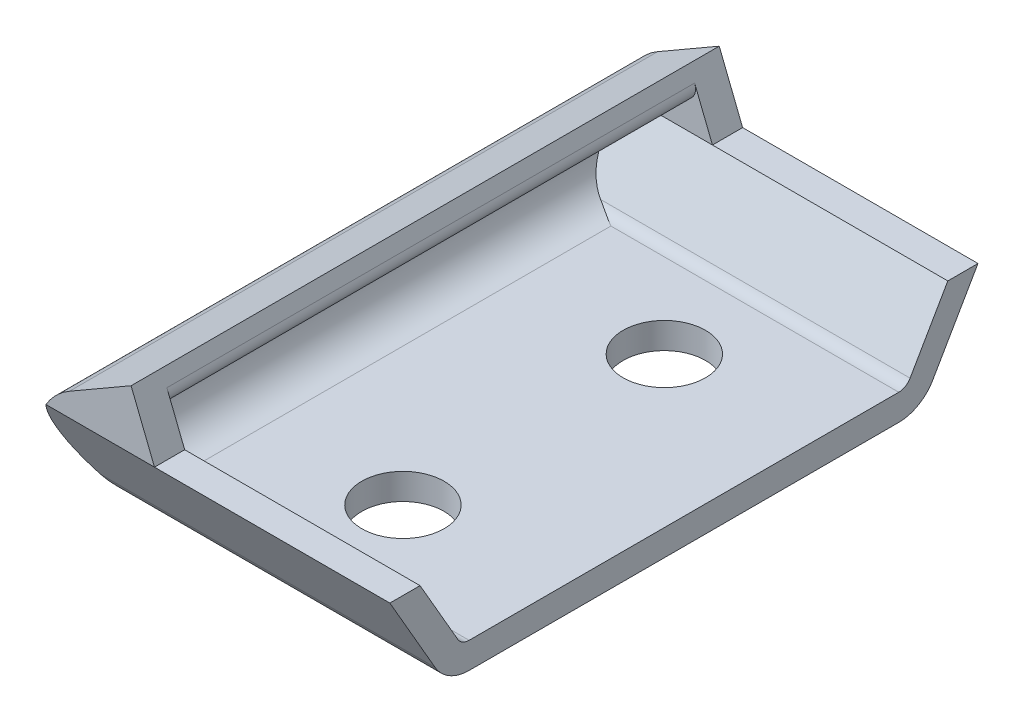
ISO-10303-21;
HEADER;
FILE_DESCRIPTION(('STEP AP214'),'2;1');
FILE_NAME('part.step','',(''),(''),'','','');
FILE_SCHEMA(('AUTOMOTIVE_DESIGN { 1 0 10303 214 1 1 1 1 }'));
ENDSEC;
DATA;
#1=APPLICATION_CONTEXT('core data for automotive mechanical design processes');
#2=APPLICATION_PROTOCOL_DEFINITION('international standard','automotive_design',2000,#1);
#3=PRODUCT_CONTEXT('',#1,'mechanical');
#4=PRODUCT('Part','Part','',(#3));
#5=PRODUCT_RELATED_PRODUCT_CATEGORY('part','',(#4));
#6=PRODUCT_DEFINITION_FORMATION('','',#4);
#7=PRODUCT_DEFINITION_CONTEXT('part definition',#1,'design');
#8=PRODUCT_DEFINITION('design','',#6,#7);
#9=PRODUCT_DEFINITION_SHAPE('','',#8);
#10=(LENGTH_UNIT() NAMED_UNIT(*) SI_UNIT(.MILLI.,.METRE.));
#11=(NAMED_UNIT(*) PLANE_ANGLE_UNIT() SI_UNIT($,.RADIAN.));
#12=(NAMED_UNIT(*) SI_UNIT($,.STERADIAN.) SOLID_ANGLE_UNIT());
#13=UNCERTAINTY_MEASURE_WITH_UNIT(LENGTH_MEASURE(1.E-05),#10,'distance_accuracy_value','');
#14=(GEOMETRIC_REPRESENTATION_CONTEXT(3) GLOBAL_UNCERTAINTY_ASSIGNED_CONTEXT((#13)) GLOBAL_UNIT_ASSIGNED_CONTEXT((#10,
#11,#12)) REPRESENTATION_CONTEXT('',''));
#15=CARTESIAN_POINT('',(0.,0.,0.));
#16=DIRECTION('',(0.,0.,1.));
#17=DIRECTION('',(1.,0.,0.));
#18=AXIS2_PLACEMENT_3D('',#15,#16,#17);
#19=CARTESIAN_POINT('',(-22.027,4.973,22.5));
#20=DIRECTION('',(0.,0.,-1.));
#21=DIRECTION('',(-1.,0.,0.));
#22=AXIS2_PLACEMENT_3D('',#19,#20,#21);
#23=CYLINDRICAL_SURFACE('',#22,2.973);
#24=CARTESIAN_POINT('',(-22.027,4.973,20.190615859));
#25=DIRECTION('',(0.,0.,-1.));
#26=DIRECTION('',(-1.,0.,0.));
#27=AXIS2_PLACEMENT_3D('',#24,#25,#26);
#28=CIRCLE('',#27,2.973);
#29=CARTESIAN_POINT('',(-23.5932056059151,7.5,20.1906158589115));
#30=VERTEX_POINT('',#29);
#31=CARTESIAN_POINT('',(-23.5130554681356,7.5479501248809,20.190615859));
#32=VERTEX_POINT('',#31);
#33=EDGE_CURVE('E193',#30,#32,#28,.T.);
#34=ORIENTED_EDGE('',*,*,#33,.F.);
#35=CARTESIAN_POINT('',(-22.027,4.973,18.7316945255782));
#36=DIRECTION('',(0.,0.499988999717658,-0.86603175470726));
#37=DIRECTION('',(0.,-0.86603175470726,-0.499988999717658));
#38=AXIS2_PLACEMENT_3D('',#35,#36,#37);
#39=ELLIPSE('',#38,3.43289952572807,2.973);
#40=CARTESIAN_POINT('',(-23.6771679936526,2.50001100028234,17.3039555430745));
#41=VERTEX_POINT('',#40);
#42=EDGE_CURVE('E25',#41,#30,#39,.T.);
#43=ORIENTED_EDGE('',*,*,#42,.F.);
#44=CARTESIAN_POINT('',(-23.6771679936526,2.50001100028234,17.3039555430745));
#45=CARTESIAN_POINT('',(-23.6157478162464,2.4590317857954,17.2802644374005));
#46=CARTESIAN_POINT('',(-23.55346104846,2.42077050641177,17.2543303719641));
#47=CARTESIAN_POINT('',(-23.4275838978581,2.34958229859011,17.1988465137735));
#48=CARTESIAN_POINT('',(-23.3639954198618,2.31664812694958,17.1693017281441));
#49=CARTESIAN_POINT('',(-23.235933504598,2.25597658891147,17.1074740495195));
#50=CARTESIAN_POINT('',(-23.1714626612422,2.22822650296746,17.075198148246));
#51=CARTESIAN_POINT('',(-23.0417104830212,2.17765731280315,17.0084547079154));
#52=CARTESIAN_POINT('',(-22.9764288366967,2.15484016961395,16.9739863042772));
#53=CARTESIAN_POINT('',(-22.766907274308,2.08959761609726,16.8612286585075));
#54=CARTESIAN_POINT('',(-22.6214696296593,2.05629367214998,16.7797620256136));
#55=CARTESIAN_POINT('',(-22.329452341209,2.01174349991716,16.6133085653336));
#56=CARTESIAN_POINT('',(-22.1828737339314,2.00047917016647,16.5283246853519));
#57=CARTESIAN_POINT('',(-22.0332888329448,2.0000049982179,16.4415710961412));
#58=CARTESIAN_POINT('',(-22.030144380803,2.00000001019049,16.4397474206714));
#59=CARTESIAN_POINT('',(-22.027,2.,16.4379237883672));
#60=B_SPLINE_CURVE_WITH_KNOTS('',3,(#44,#45,#46,#47,#48,#49,#50,#51,#52,#53,#54,#55,#56,#57,#58,
#59),.UNSPECIFIED.,.F.,.F.,(4,2,2,2,2,2,2,4),(0.,0.232451889469659,0.464585010729443,
0.696140872484332,0.927788617863217,1.43605562472871,1.94390500876741,1.9548100637413),.UNSPECIFIED.);
#61=CARTESIAN_POINT('',(-22.027,2.,16.4379237883672));
#62=VERTEX_POINT('',#61);
#63=EDGE_CURVE('E179',#41,#62,#60,.T.);
#64=ORIENTED_EDGE('',*,*,#63,.T.);
#65=DIRECTION('',(0.,0.,-1.));
#66=VECTOR('',#65,1.);
#67=CARTESIAN_POINT('',(-22.027,2.,22.5));
#68=LINE('',#67,#66);
#69=CARTESIAN_POINT('',(-22.027,2.,-16.4379237883672));
#70=VERTEX_POINT('',#69);
#71=EDGE_CURVE('E328',#62,#70,#68,.T.);
#72=ORIENTED_EDGE('',*,*,#71,.T.);
#73=CARTESIAN_POINT('',(-23.6771679936526,2.50001100028234,-17.3039555430745));
#74=CARTESIAN_POINT('',(-23.6157478162463,2.45903178579538,-17.2802644374005));
#75=CARTESIAN_POINT('',(-23.55346104846,2.42077050641174,-17.2543303719641));
#76=CARTESIAN_POINT('',(-23.427583897858,2.34958229859005,-17.1988465137734));
#77=CARTESIAN_POINT('',(-23.3639954198616,2.31664812694951,-17.1693017281441));
#78=CARTESIAN_POINT('',(-23.2359335045978,2.25597658891141,-17.1074740495194));
#79=CARTESIAN_POINT('',(-23.171462661242,2.22822650296742,-17.075198148246));
#80=CARTESIAN_POINT('',(-23.0417104830212,2.17765731280313,-17.0084547079154));
#81=CARTESIAN_POINT('',(-22.9764288366967,2.15484016961394,-16.9739863042771));
#82=CARTESIAN_POINT('',(-22.7669072743079,2.08959761609727,-16.8612286585076));
#83=CARTESIAN_POINT('',(-22.6214696296589,2.05629367214998,-16.7797620256143));
#84=CARTESIAN_POINT('',(-22.3294523412094,2.01174349991716,-16.613308565333));
#85=CARTESIAN_POINT('',(-22.1828737339329,2.00047917016646,-16.5283246853493));
#86=CARTESIAN_POINT('',(-22.0332888329448,2.0000049982179,-16.4415710961411));
#87=CARTESIAN_POINT('',(-22.030144380803,2.00000001019049,-16.4397474206714));
#88=CARTESIAN_POINT('',(-22.027,2.,-16.4379237883672));
#89=B_SPLINE_CURVE_WITH_KNOTS('',3,(#73,#74,#75,#76,#77,#78,#79,#80,#81,#82,#83,#84,#85,#86,#87,
#88),.UNSPECIFIED.,.F.,.F.,(4,2,2,2,2,2,2,4),(0.,0.232451889469771,0.464585010729636,
0.696140872484415,0.927788617863219,1.43605562472868,1.94390500876741,1.9548100637413),.UNSPECIFIED.);
#90=CARTESIAN_POINT('',(-23.6771679936526,2.50001100028234,-17.3039555430745));
#91=VERTEX_POINT('',#90);
#92=EDGE_CURVE('E248',#70,#91,#89,.F.);
#93=ORIENTED_EDGE('',*,*,#92,.T.);
#94=CARTESIAN_POINT('',(-22.027,4.973,-18.7316945255782));
#95=DIRECTION('',(0.,0.499988999717658,0.86603175470726));
#96=DIRECTION('',(0.,0.86603175470726,-0.499988999717658));
#97=AXIS2_PLACEMENT_3D('',#94,#95,#96);
#98=ELLIPSE('',#97,3.43289952572807,2.973);
#99=CARTESIAN_POINT('',(-23.5932056059151,7.5,-20.190615859));
#100=VERTEX_POINT('',#99);
#101=EDGE_CURVE('E11',#100,#91,#98,.T.);
#102=ORIENTED_EDGE('',*,*,#101,.F.);
#103=CARTESIAN_POINT('',(-22.027,4.973,-20.190615859));
#104=DIRECTION('',(0.,0.,-1.));
#105=DIRECTION('',(-1.,0.,0.));
#106=AXIS2_PLACEMENT_3D('',#103,#104,#105);
#107=CIRCLE('',#106,2.973);
#108=CARTESIAN_POINT('',(-23.5130554681356,7.5479501248809,-20.190615859));
#109=VERTEX_POINT('',#108);
#110=EDGE_CURVE('E208',#100,#109,#107,.T.);
#111=ORIENTED_EDGE('',*,*,#110,.T.);
#112=DIRECTION('',(0.,0.,-1.));
#113=VECTOR('',#112,1.);
#114=CARTESIAN_POINT('',(-23.5130554681356,7.5479501248809,22.5));
#115=LINE('',#114,#113);
#116=EDGE_CURVE('E308',#32,#109,#115,.T.);
#117=ORIENTED_EDGE('',*,*,#116,.F.);
#118=EDGE_LOOP('',(#34,#43,#64,#72,#93,#102,#111,#117));
#119=FACE_BOUND('',#118,.T.);
#120=ADVANCED_FACE('F17',(#119),#23,.F.);
#121=CARTESIAN_POINT('',(-19.8015793016685,9.68991761339247,22.5));
#122=DIRECTION('',(0.499850477004925,-0.866111713717087,0.));
#123=DIRECTION('',(0.866111713717087,0.499850477004925,0.));
#124=AXIS2_PLACEMENT_3D('',#121,#122,#123);
#125=PLANE('',#124);
#126=DIRECTION('',(0.866111713717087,0.499850477004925,0.));
#127=VECTOR('',#126,1.);
#128=CARTESIAN_POINT('',(-19.8015793016685,9.68991761339247,20.190615859));
#129=LINE('',#128,#127);
#130=CARTESIAN_POINT('',(-19.8015793016685,9.68991761339247,20.190615859));
#131=VERTEX_POINT('',#130);
#132=EDGE_CURVE('E32',#32,#131,#129,.T.);
#133=ORIENTED_EDGE('',*,*,#132,.F.);
#134=ORIENTED_EDGE('',*,*,#116,.T.);
#135=DIRECTION('',(0.866111713717087,0.499850477004925,0.));
#136=VECTOR('',#135,1.);
#137=CARTESIAN_POINT('',(-19.8015793016685,9.68991761339247,-20.190615859));
#138=LINE('',#137,#136);
#139=CARTESIAN_POINT('',(-19.8015793016685,9.68991761339247,-20.190615859));
#140=VERTEX_POINT('',#139);
#141=EDGE_CURVE('E205',#109,#140,#138,.T.);
#142=ORIENTED_EDGE('',*,*,#141,.T.);
#143=DIRECTION('',(0.,0.,-1.));
#144=VECTOR('',#143,1.);
#145=CARTESIAN_POINT('',(-19.8015793016685,9.68991761339247,22.5));
#146=LINE('',#145,#144);
#147=EDGE_CURVE('E321',#131,#140,#146,.T.);
#148=ORIENTED_EDGE('',*,*,#147,.F.);
#149=EDGE_LOOP('',(#133,#134,#142,#148));
#150=FACE_BOUND('',#149,.T.);
#151=ADVANCED_FACE('F285',(#150),#125,.T.);
#152=CARTESIAN_POINT('',(-20.3014297786734,10.5560293271095,22.5));
#153=DIRECTION('',(0.,0.,-1.));
#154=DIRECTION('',(-1.,0.,0.));
#155=AXIS2_PLACEMENT_3D('',#152,#153,#154);
#156=CYLINDRICAL_SURFACE('',#155,0.999999999999998);
#157=DIRECTION('',(0.,0.,-1.));
#158=VECTOR('',#157,1.);
#159=CARTESIAN_POINT('',(-19.3723617542736,10.9259382429766,22.5));
#160=LINE('',#159,#158);
#161=CARTESIAN_POINT('',(-19.3723617542736,10.9259382429766,20.190615859));
#162=VERTEX_POINT('',#161);
#163=CARTESIAN_POINT('',(-19.3723617542736,10.9259382429766,-20.190615859));
#164=VERTEX_POINT('',#163);
#165=EDGE_CURVE('E317',#162,#164,#160,.T.);
#166=ORIENTED_EDGE('',*,*,#165,.F.);
#167=CARTESIAN_POINT('',(-20.3014297786734,10.5560293271095,20.190615859));
#168=DIRECTION('',(0.,0.,-1.));
#169=DIRECTION('',(-1.,0.,0.));
#170=AXIS2_PLACEMENT_3D('',#167,#168,#169);
#171=CIRCLE('',#170,0.999999999999998);
#172=EDGE_CURVE('E40',#162,#131,#171,.T.);
#173=ORIENTED_EDGE('',*,*,#172,.T.);
#174=ORIENTED_EDGE('',*,*,#147,.T.);
#175=CARTESIAN_POINT('',(-20.3014297786734,10.5560293271095,-20.190615859));
#176=DIRECTION('',(0.,0.,-1.));
#177=DIRECTION('',(-1.,0.,0.));
#178=AXIS2_PLACEMENT_3D('',#175,#176,#177);
#179=CIRCLE('',#178,0.999999999999998);
#180=EDGE_CURVE('E202',#164,#140,#179,.T.);
#181=ORIENTED_EDGE('',*,*,#180,.F.);
#182=EDGE_LOOP('',(#166,#173,#174,#181));
#183=FACE_BOUND('',#182,.T.);
#184=ADVANCED_FACE('F279',(#183),#156,.T.);
#185=CARTESIAN_POINT('',(-25.5,7.5,-22.5));
#186=DIRECTION('',(0.,1.,0.));
#187=DIRECTION('',(0.,0.,1.));
#188=AXIS2_PLACEMENT_3D('',#185,#186,#187);
#189=PLANE('',#188);
#190=DIRECTION('',(1.,0.,0.));
#191=VECTOR('',#190,1.);
#192=CARTESIAN_POINT('',(-25.5,7.5,-22.5));
#193=LINE('',#192,#191);
#194=CARTESIAN_POINT('',(-18.0083226656335,7.5,-22.5));
#195=VERTEX_POINT('',#194);
#196=CARTESIAN_POINT('',(0.,7.5,-22.5));
#197=VERTEX_POINT('',#196);
#198=EDGE_CURVE('E180',#195,#197,#193,.T.);
#199=ORIENTED_EDGE('',*,*,#198,.F.);
#200=DIRECTION('',(0.,0.,-1.));
#201=VECTOR('',#200,1.);
#202=CARTESIAN_POINT('',(-18.0083226656335,7.5,-20.190615859));
#203=LINE('',#202,#201);
#204=CARTESIAN_POINT('',(-18.0083226656335,7.5,-20.190615859));
#205=VERTEX_POINT('',#204);
#206=EDGE_CURVE('E199',#205,#195,#203,.T.);
#207=ORIENTED_EDGE('',*,*,#206,.F.);
#208=DIRECTION('',(1.,0.,0.));
#209=VECTOR('',#208,1.);
#210=CARTESIAN_POINT('',(-25.5,7.5,-20.1906158589115));
#211=LINE('',#210,#209);
#212=CARTESIAN_POINT('',(0.,7.5,-20.1906158589115));
#213=VERTEX_POINT('',#212);
#214=EDGE_CURVE('E237',#205,#213,#211,.T.);
#215=ORIENTED_EDGE('',*,*,#214,.T.);
#216=DIRECTION('',(0.,0.,1.));
#217=VECTOR('',#216,1.);
#218=CARTESIAN_POINT('',(0.,7.5,-22.5));
#219=LINE('',#218,#217);
#220=EDGE_CURVE('E216',#197,#213,#219,.T.);
#221=ORIENTED_EDGE('',*,*,#220,.F.);
#222=EDGE_LOOP('',(#199,#207,#215,#221));
#223=FACE_BOUND('',#222,.T.);
#224=ADVANCED_FACE('F275',(#223),#189,.T.);
#225=CARTESIAN_POINT('',(-22.027,0.,22.5));
#226=DIRECTION('',(0.,1.,0.));
#227=DIRECTION('',(0.,0.,1.));
#228=AXIS2_PLACEMENT_3D('',#225,#226,#227);
#229=PLANE('',#228);
#230=CARTESIAN_POINT('',(-11.5,0.,10.));
#231=DIRECTION('',(0.,1.,0.));
#232=DIRECTION('',(1.,0.,0.));
#233=AXIS2_PLACEMENT_3D('',#230,#231,#232);
#234=CIRCLE('',#233,3.15);
#235=CARTESIAN_POINT('',(-8.35,0.,10.));
#236=VERTEX_POINT('',#235);
#237=EDGE_CURVE('E398',#236,#236,#234,.T.);
#238=ORIENTED_EDGE('',*,*,#237,.T.);
#239=EDGE_LOOP('',(#238));
#240=FACE_BOUND('',#239,.T.);
#241=CARTESIAN_POINT('',(-11.5,0.,-10.));
#242=DIRECTION('',(0.,1.,0.));
#243=DIRECTION('',(1.,0.,0.));
#244=AXIS2_PLACEMENT_3D('',#241,#242,#243);
#245=CIRCLE('',#244,3.15);
#246=CARTESIAN_POINT('',(-8.35,0.,-10.));
#247=VERTEX_POINT('',#246);
#248=EDGE_CURVE('E402',#247,#247,#245,.T.);
#249=ORIENTED_EDGE('',*,*,#248,.T.);
#250=EDGE_LOOP('',(#249));
#251=FACE_BOUND('',#250,.T.);
#252=DIRECTION('',(0.,0.,-1.));
#253=VECTOR('',#252,1.);
#254=CARTESIAN_POINT('',(-22.027,0.,25.5));
#255=LINE('',#254,#253);
#256=CARTESIAN_POINT('',(-22.027,0.,16.4379237883672));
#257=VERTEX_POINT('',#256);
#258=CARTESIAN_POINT('',(-22.027,0.,-16.4379237883672));
#259=VERTEX_POINT('',#258);
#260=EDGE_CURVE('E211',#257,#259,#255,.T.);
#261=ORIENTED_EDGE('',*,*,#260,.T.);
#262=DIRECTION('',(1.,0.,0.));
#263=VECTOR('',#262,1.);
#264=CARTESIAN_POINT('',(-27.,0.,-16.4379237883672));
#265=LINE('',#264,#263);
#266=CARTESIAN_POINT('',(0.,0.,-16.4379237883672));
#267=VERTEX_POINT('',#266);
#268=EDGE_CURVE('E346',#259,#267,#265,.T.);
#269=ORIENTED_EDGE('',*,*,#268,.T.);
#270=DIRECTION('',(0.,0.,-1.));
#271=VECTOR('',#270,1.);
#272=CARTESIAN_POINT('',(0.,0.,22.5));
#273=LINE('',#272,#271);
#274=CARTESIAN_POINT('',(0.,0.,16.4379237883672));
#275=VERTEX_POINT('',#274);
#276=EDGE_CURVE('E412',#275,#267,#273,.T.);
#277=ORIENTED_EDGE('',*,*,#276,.F.);
#278=DIRECTION('',(1.,0.,0.));
#279=VECTOR('',#278,1.);
#280=CARTESIAN_POINT('',(-27.,0.,16.4379237883672));
#281=LINE('',#280,#279);
#282=EDGE_CURVE('E344',#257,#275,#281,.T.);
#283=ORIENTED_EDGE('',*,*,#282,.F.);
#284=EDGE_LOOP('',(#261,#269,#277,#283));
#285=FACE_BOUND('',#284,.T.);
#286=ADVANCED_FACE('F278',(#240,#251,#285),#229,.F.);
#287=CARTESIAN_POINT('',(-22.027,4.973,22.5));
#288=DIRECTION('',(0.,0.,-1.));
#289=DIRECTION('',(-1.,0.,0.));
#290=AXIS2_PLACEMENT_3D('',#287,#288,#289);
#291=CYLINDRICAL_SURFACE('',#290,4.973);
#292=CARTESIAN_POINT('',(-25.5863860738608,1.50003300084702,-19.036019052489));
#293=CARTESIAN_POINT('',(-25.5042354541603,1.41584505936753,-18.987392945366));
#294=CARTESIAN_POINT('',(-25.4200739234011,1.33555754939051,-18.9356066560965));
#295=CARTESIAN_POINT('',(-25.248452418833,1.18272696930638,-18.8267178984012));
#296=CARTESIAN_POINT('',(-25.1609968011457,1.11017412596017,-18.7696223136766));
#297=CARTESIAN_POINT('',(-24.9836047916103,0.972780128605373,-18.6511953143474));
#298=CARTESIAN_POINT('',(-24.8936780350864,0.907913149367118,-18.5898792465356));
#299=CARTESIAN_POINT('',(-24.71149469524,0.785366249331379,-18.4635462965864));
#300=CARTESIAN_POINT('',(-24.6192369730629,0.727689926699678,-18.3985275851828));
#301=CARTESIAN_POINT('',(-24.3839849342435,0.59095179000316,-18.2305731174307));
#302=CARTESIAN_POINT('',(-24.2397286899331,0.516513959214386,-18.1256163372149));
#303=CARTESIAN_POINT('',(-23.9479817478057,0.383196523826884,-17.9104601626027));
#304=CARTESIAN_POINT('',(-23.800490043535,0.324321836960381,-17.8002591240444));
#305=CARTESIAN_POINT('',(-23.502970615726,0.221469577528516,-17.5759101762769));
#306=CARTESIAN_POINT('',(-23.3529394645697,0.177514162809716,-17.4617566716102));
#307=CARTESIAN_POINT('',(-23.0513740840305,0.104173020399998,-17.2309284123921));
#308=CARTESIAN_POINT('',(-22.8998400468736,0.074785453315179,-17.1142539780856));
#309=CARTESIAN_POINT('',(-22.5119871206034,0.0179727417272871,-16.8146009017592));
#310=CARTESIAN_POINT('',(-22.2749376916609,0.000542640190337614,-16.6304959877747));
#311=CARTESIAN_POINT('',(-22.0344257899743,4.16166183938821E-06,-16.4436913732303));
#312=CARTESIAN_POINT('',(-22.0307128612977,3.72453672128743E-09,-16.4408075540882));
#313=CARTESIAN_POINT('',(-22.027,0.,-16.4379237883672));
#314=B_SPLINE_CURVE_WITH_KNOTS('',3,(#292,#293,#294,#295,#296,#297,#298,#299,#300,#301,#302,
#303,#304,#305,#306,#307,#308,#309,#310,#311,#312,#313),.UNSPECIFIED.,.F.,.F.,(4,2,2,2,2,2,2,2,
2,2,4),(0.,0.381624119740651,0.762760170675112,1.14257689041508,1.52258291199877,
2.10164831755239,2.68089648140909,3.2610012083889,3.84103267038935,4.74052048789505,
4.75462439358218),.UNSPECIFIED.);
#315=CARTESIAN_POINT('',(-25.5863860738608,1.50003300084703,-19.036019052489));
#316=VERTEX_POINT('',#315);
#317=EDGE_CURVE('E362',#259,#316,#314,.F.);
#318=ORIENTED_EDGE('',*,*,#317,.F.);
#319=ORIENTED_EDGE('',*,*,#260,.F.);
#320=CARTESIAN_POINT('',(-25.5863860738608,1.50003300084703,19.036019052489));
#321=CARTESIAN_POINT('',(-25.5042354541603,1.41584505936753,18.987392945366));
#322=CARTESIAN_POINT('',(-25.4200739234011,1.3355575493905,18.9356066560964));
#323=CARTESIAN_POINT('',(-25.248452418833,1.18272696930636,18.8267178984011));
#324=CARTESIAN_POINT('',(-25.1609968011457,1.11017412596016,18.7696223136766));
#325=CARTESIAN_POINT('',(-24.9836047916103,0.972780128605358,18.6511953143474));
#326=CARTESIAN_POINT('',(-24.8936780350864,0.907913149367106,18.5898792465356));
#327=CARTESIAN_POINT('',(-24.71149469524,0.785366249331374,18.4635462965864));
#328=CARTESIAN_POINT('',(-24.6192369730629,0.727689926699675,18.3985275851828));
#329=CARTESIAN_POINT('',(-24.3839849342435,0.590951790003161,18.2305731174307));
#330=CARTESIAN_POINT('',(-24.2397286899331,0.516513959214387,18.1256163372149));
#331=CARTESIAN_POINT('',(-23.9479817478057,0.383196523826887,17.9104601626027));
#332=CARTESIAN_POINT('',(-23.800490043535,0.324321836960384,17.8002591240444));
#333=CARTESIAN_POINT('',(-23.5029706157259,0.221469577528519,17.575910176277));
#334=CARTESIAN_POINT('',(-23.3529394645697,0.177514162809718,17.4617566716103));
#335=CARTESIAN_POINT('',(-23.0513740840306,0.104173020399998,17.230928412392));
#336=CARTESIAN_POINT('',(-22.8998400468738,0.0747854533151778,17.1142539780853));
#337=CARTESIAN_POINT('',(-22.5119871206031,0.0179727417272886,16.8146009017596));
#338=CARTESIAN_POINT('',(-22.2749376916596,0.000542640190347407,16.6304959877764));
#339=CARTESIAN_POINT('',(-22.0344257899743,4.16166183885795E-06,16.4436913732303));
#340=CARTESIAN_POINT('',(-22.0307128612976,3.72453602705369E-09,16.4408075540883));
#341=CARTESIAN_POINT('',(-22.027,0.,16.4379237883672));
#342=B_SPLINE_CURVE_WITH_KNOTS('',3,(#320,#321,#322,#323,#324,#325,#326,#327,#328,#329,#330,
#331,#332,#333,#334,#335,#336,#337,#338,#339,#340,#341),.UNSPECIFIED.,.F.,.F.,(4,2,2,2,2,2,2,2,
2,2,4),(0.,0.381624119740669,0.762760170675145,1.1425768904151,1.52258291199877,
2.10164831755238,2.68089648140908,3.2610012083889,3.84103267038934,4.74052048789506,
4.75462439358219),.UNSPECIFIED.);
#343=CARTESIAN_POINT('',(-25.5863860738608,1.50003300084702,19.036019052489));
#344=VERTEX_POINT('',#343);
#345=EDGE_CURVE('E355',#344,#257,#342,.T.);
#346=ORIENTED_EDGE('',*,*,#345,.F.);
#347=CARTESIAN_POINT('',(-22.027,4.973,21.0410786666667));
#348=DIRECTION('',(0.,0.499988999717658,-0.86603175470726));
#349=DIRECTION('',(0.,-0.86603175470726,-0.499988999717658));
#350=AXIS2_PLACEMENT_3D('',#347,#348,#349);
#351=ELLIPSE('',#350,5.74228366681658,4.973);
#352=CARTESIAN_POINT('',(-26.3101063493684,7.5,22.5));
#353=VERTEX_POINT('',#352);
#354=EDGE_CURVE('E353',#344,#353,#351,.T.);
#355=ORIENTED_EDGE('',*,*,#354,.T.);
#356=CARTESIAN_POINT('',(-22.027,4.973,22.5));
#357=DIRECTION('',(0.,0.,1.));
#358=DIRECTION('',(1.,0.,0.));
#359=AXIS2_PLACEMENT_3D('',#356,#357,#358);
#360=CIRCLE('',#359,4.973);
#361=CARTESIAN_POINT('',(-24.5127564221455,9.28017355231507,22.5));
#362=VERTEX_POINT('',#361);
#363=EDGE_CURVE('E160',#362,#353,#360,.T.);
#364=ORIENTED_EDGE('',*,*,#363,.F.);
#365=DIRECTION('',(0.,0.,-1.));
#366=VECTOR('',#365,1.);
#367=CARTESIAN_POINT('',(-24.5127564221455,9.28017355231507,22.5));
#368=LINE('',#367,#366);
#369=CARTESIAN_POINT('',(-24.5127564221455,9.28017355231507,-22.5));
#370=VERTEX_POINT('',#369);
#371=EDGE_CURVE('E414',#362,#370,#368,.T.);
#372=ORIENTED_EDGE('',*,*,#371,.T.);
#373=CARTESIAN_POINT('',(-22.027,4.973,-22.5));
#374=DIRECTION('',(0.,0.,1.));
#375=DIRECTION('',(1.,0.,0.));
#376=AXIS2_PLACEMENT_3D('',#373,#374,#375);
#377=CIRCLE('',#376,4.973);
#378=CARTESIAN_POINT('',(-26.3101063493684,7.5,-22.5));
#379=VERTEX_POINT('',#378);
#380=EDGE_CURVE('E441',#370,#379,#377,.T.);
#381=ORIENTED_EDGE('',*,*,#380,.T.);
#382=CARTESIAN_POINT('',(-22.027,4.973,-21.0410786666667));
#383=DIRECTION('',(0.,0.499988999717658,0.86603175470726));
#384=DIRECTION('',(0.,0.86603175470726,-0.499988999717658));
#385=AXIS2_PLACEMENT_3D('',#382,#383,#384);
#386=ELLIPSE('',#385,5.74228366681658,4.973);
#387=EDGE_CURVE('E350',#379,#316,#386,.T.);
#388=ORIENTED_EDGE('',*,*,#387,.T.);
#389=EDGE_LOOP('',(#318,#319,#346,#355,#364,#372,#381,#388));
#390=FACE_BOUND('',#389,.T.);
#391=ADVANCED_FACE('F289',(#390),#291,.T.);
#392=CARTESIAN_POINT('',(-22.027,2.,22.5));
#393=DIRECTION('',(0.,1.,0.));
#394=DIRECTION('',(0.,0.,1.));
#395=AXIS2_PLACEMENT_3D('',#392,#393,#394);
#396=PLANE('',#395);
#397=CARTESIAN_POINT('',(-11.5,2.,10.));
#398=DIRECTION('',(0.,1.,0.));
#399=DIRECTION('',(1.,0.,0.));
#400=AXIS2_PLACEMENT_3D('',#397,#398,#399);
#401=CIRCLE('',#400,3.15);
#402=CARTESIAN_POINT('',(-8.35,2.,10.));
#403=VERTEX_POINT('',#402);
#404=EDGE_CURVE('E619',#403,#403,#401,.T.);
#405=ORIENTED_EDGE('',*,*,#404,.F.);
#406=EDGE_LOOP('',(#405));
#407=FACE_BOUND('',#406,.T.);
#408=CARTESIAN_POINT('',(-11.5,2.,-10.));
#409=DIRECTION('',(0.,1.,0.));
#410=DIRECTION('',(1.,0.,0.));
#411=AXIS2_PLACEMENT_3D('',#408,#409,#410);
#412=CIRCLE('',#411,3.15);
#413=CARTESIAN_POINT('',(-8.35,2.,-10.));
#414=VERTEX_POINT('',#413);
#415=EDGE_CURVE('E188',#414,#414,#412,.T.);
#416=ORIENTED_EDGE('',*,*,#415,.F.);
#417=EDGE_LOOP('',(#416));
#418=FACE_BOUND('',#417,.T.);
#419=DIRECTION('',(1.,0.,0.));
#420=VECTOR('',#419,1.);
#421=CARTESIAN_POINT('',(-25.5,2.,-16.4379237883672));
#422=LINE('',#421,#420);
#423=CARTESIAN_POINT('',(0.,2.,-16.4379237883672));
#424=VERTEX_POINT('',#423);
#425=EDGE_CURVE('E314',#70,#424,#422,.T.);
#426=ORIENTED_EDGE('',*,*,#425,.F.);
#427=ORIENTED_EDGE('',*,*,#71,.F.);
#428=DIRECTION('',(1.,0.,0.));
#429=VECTOR('',#428,1.);
#430=CARTESIAN_POINT('',(-25.5,2.,16.4379237883672));
#431=LINE('',#430,#429);
#432=CARTESIAN_POINT('',(0.,2.,16.4379237883672));
#433=VERTEX_POINT('',#432);
#434=EDGE_CURVE('E168',#62,#433,#431,.T.);
#435=ORIENTED_EDGE('',*,*,#434,.T.);
#436=DIRECTION('',(0.,0.,-1.));
#437=VECTOR('',#436,1.);
#438=CARTESIAN_POINT('',(0.,2.,22.5));
#439=LINE('',#438,#437);
#440=EDGE_CURVE('E320',#433,#424,#439,.T.);
#441=ORIENTED_EDGE('',*,*,#440,.T.);
#442=EDGE_LOOP('',(#426,#427,#435,#441));
#443=FACE_BOUND('',#442,.T.);
#444=ADVANCED_FACE('F286',(#407,#418,#443),#396,.T.);
#445=CARTESIAN_POINT('',(0.,0.,22.5));
#446=DIRECTION('',(-1.,0.,0.));
#447=DIRECTION('',(0.,0.,1.));
#448=AXIS2_PLACEMENT_3D('',#445,#446,#447);
#449=PLANE('',#448);
#450=ORIENTED_EDGE('',*,*,#440,.F.);
#451=CARTESIAN_POINT('',(0.,3.00000000000001,16.4379237883672));
#452=DIRECTION('',(1.,0.,0.));
#453=DIRECTION('',(0.,0.,-1.));
#454=AXIS2_PLACEMENT_3D('',#451,#452,#453);
#455=CIRCLE('',#454,1.00000000000001);
#456=CARTESIAN_POINT('',(0.,2.50001100028234,17.3039555430745));
#457=VERTEX_POINT('',#456);
#458=EDGE_CURVE('E225',#457,#433,#455,.T.);
#459=ORIENTED_EDGE('',*,*,#458,.F.);
#460=DIRECTION('',(0.,0.86603175470726,0.499988999717658));
#461=VECTOR('',#460,1.);
#462=CARTESIAN_POINT('',(0.,2.50001100028234,17.3039555430745));
#463=LINE('',#462,#461);
#464=CARTESIAN_POINT('',(0.,7.5,20.1906158589115));
#465=VERTEX_POINT('',#464);
#466=EDGE_CURVE('E228',#457,#465,#463,.T.);
#467=ORIENTED_EDGE('',*,*,#466,.T.);
#468=DIRECTION('',(0.,0.,1.));
#469=VECTOR('',#468,1.);
#470=CARTESIAN_POINT('',(0.,7.5,20.1906158589115));
#471=LINE('',#470,#469);
#472=CARTESIAN_POINT('',(0.,7.5,22.5));
#473=VERTEX_POINT('',#472);
#474=EDGE_CURVE('E214',#465,#473,#471,.T.);
#475=ORIENTED_EDGE('',*,*,#474,.T.);
#476=DIRECTION('',(0.,0.86603175470726,0.499988999717658));
#477=VECTOR('',#476,1.);
#478=CARTESIAN_POINT('',(0.,1.50003300084703,19.036019052489));
#479=LINE('',#478,#477);
#480=CARTESIAN_POINT('',(0.,1.50003300084702,19.036019052489));
#481=VERTEX_POINT('',#480);
#482=EDGE_CURVE('E175',#481,#473,#479,.T.);
#483=ORIENTED_EDGE('',*,*,#482,.F.);
#484=CARTESIAN_POINT('',(0.,3.00000000000002,16.4379237883672));
#485=DIRECTION('',(1.,0.,0.));
#486=DIRECTION('',(0.,0.,-1.));
#487=AXIS2_PLACEMENT_3D('',#484,#485,#486);
#488=CIRCLE('',#487,3.00000000000002);
#489=EDGE_CURVE('E338',#481,#275,#488,.T.);
#490=ORIENTED_EDGE('',*,*,#489,.T.);
#491=ORIENTED_EDGE('',*,*,#276,.T.);
#492=CARTESIAN_POINT('',(0.,3.00000000000001,-16.4379237883672));
#493=DIRECTION('',(1.,0.,0.));
#494=DIRECTION('',(0.,0.,-1.));
#495=AXIS2_PLACEMENT_3D('',#492,#493,#494);
#496=CIRCLE('',#495,3.00000000000001);
#497=CARTESIAN_POINT('',(0.,1.50003300084703,-19.036019052489));
#498=VERTEX_POINT('',#497);
#499=EDGE_CURVE('E335',#267,#498,#496,.T.);
#500=ORIENTED_EDGE('',*,*,#499,.T.);
#501=DIRECTION('',(0.,-0.86603175470726,0.499988999717658));
#502=VECTOR('',#501,1.);
#503=CARTESIAN_POINT('',(0.,7.5,-22.5));
#504=LINE('',#503,#502);
#505=EDGE_CURVE('E332',#197,#498,#504,.T.);
#506=ORIENTED_EDGE('',*,*,#505,.F.);
#507=ORIENTED_EDGE('',*,*,#220,.T.);
#508=DIRECTION('',(0.,-0.86603175470726,0.499988999717658));
#509=VECTOR('',#508,1.);
#510=CARTESIAN_POINT('',(0.,7.5,-20.1906158589115));
#511=LINE('',#510,#509);
#512=CARTESIAN_POINT('',(0.,2.50001100028234,-17.3039555430745));
#513=VERTEX_POINT('',#512);
#514=EDGE_CURVE('E219',#213,#513,#511,.T.);
#515=ORIENTED_EDGE('',*,*,#514,.T.);
#516=CARTESIAN_POINT('',(0.,3.,-16.4379237883672));
#517=DIRECTION('',(1.,0.,0.));
#518=DIRECTION('',(0.,0.,-1.));
#519=AXIS2_PLACEMENT_3D('',#516,#517,#518);
#520=CIRCLE('',#519,1.);
#521=EDGE_CURVE('E222',#424,#513,#520,.T.);
#522=ORIENTED_EDGE('',*,*,#521,.F.);
#523=EDGE_LOOP('',(#450,#459,#467,#475,#483,#490,#491,#500,#506,#507,#515,#522));
#524=FACE_BOUND('',#523,.T.);
#525=ADVANCED_FACE('F288',(#524),#449,.F.);
#526=CARTESIAN_POINT('',(-18.0083226656335,7.5,22.5));
#527=DIRECTION('',(-0.929068024399755,-0.36990891586705,0.));
#528=DIRECTION('',(0.36990891586705,-0.929068024399755,0.));
#529=AXIS2_PLACEMENT_3D('',#526,#527,#528);
#530=PLANE('',#529);
#531=DIRECTION('',(0.,0.,-1.));
#532=VECTOR('',#531,1.);
#533=CARTESIAN_POINT('',(-19.8,12.,22.5));
#534=LINE('',#533,#532);
#535=CARTESIAN_POINT('',(-19.8,12.,22.5));
#536=VERTEX_POINT('',#535);
#537=CARTESIAN_POINT('',(-19.8,12.,-22.5));
#538=VERTEX_POINT('',#537);
#539=EDGE_CURVE('E156',#536,#538,#534,.T.);
#540=ORIENTED_EDGE('',*,*,#539,.F.);
#541=DIRECTION('',(-0.36990891586705,0.929068024399755,0.));
#542=VECTOR('',#541,1.);
#543=CARTESIAN_POINT('',(-18.0083226656335,7.5,22.5));
#544=LINE('',#543,#542);
#545=CARTESIAN_POINT('',(-18.0083226656335,7.5,22.5));
#546=VERTEX_POINT('',#545);
#547=EDGE_CURVE('E148',#546,#536,#544,.T.);
#548=ORIENTED_EDGE('',*,*,#547,.F.);
#549=DIRECTION('',(0.,0.,1.));
#550=VECTOR('',#549,1.);
#551=CARTESIAN_POINT('',(-18.0083226656335,7.5,20.190615859));
#552=LINE('',#551,#550);
#553=CARTESIAN_POINT('',(-18.0083226656335,7.5,20.1906158589115));
#554=VERTEX_POINT('',#553);
#555=EDGE_CURVE('E153',#554,#546,#552,.T.);
#556=ORIENTED_EDGE('',*,*,#555,.F.);
#557=DIRECTION('',(-0.369908915867049,0.929068024399755,0.));
#558=VECTOR('',#557,1.);
#559=CARTESIAN_POINT('',(-18.0083226656335,7.5,20.190615859));
#560=LINE('',#559,#558);
#561=EDGE_CURVE('E185',#554,#162,#560,.T.);
#562=ORIENTED_EDGE('',*,*,#561,.T.);
#563=ORIENTED_EDGE('',*,*,#165,.T.);
#564=DIRECTION('',(-0.369908915867049,0.929068024399755,0.));
#565=VECTOR('',#564,1.);
#566=CARTESIAN_POINT('',(-18.0083226656335,7.5,-20.190615859));
#567=LINE('',#566,#565);
#568=EDGE_CURVE('E196',#205,#164,#567,.T.);
#569=ORIENTED_EDGE('',*,*,#568,.F.);
#570=ORIENTED_EDGE('',*,*,#206,.T.);
#571=DIRECTION('',(-0.36990891586705,0.929068024399755,0.));
#572=VECTOR('',#571,1.);
#573=CARTESIAN_POINT('',(-18.0083226656335,7.5,-22.5));
#574=LINE('',#573,#572);
#575=EDGE_CURVE('E437',#195,#538,#574,.T.);
#576=ORIENTED_EDGE('',*,*,#575,.T.);
#577=EDGE_LOOP('',(#540,#548,#556,#562,#563,#569,#570,#576));
#578=FACE_BOUND('',#577,.T.);
#579=ADVANCED_FACE('F150',(#578),#530,.F.);
#580=CARTESIAN_POINT('',(-27.,7.5,-22.5));
#581=DIRECTION('',(0.,0.499988999717658,0.86603175470726));
#582=DIRECTION('',(0.,-0.86603175470726,0.499988999717658));
#583=AXIS2_PLACEMENT_3D('',#580,#581,#582);
#584=PLANE('',#583);
#585=DIRECTION('',(-1.,0.,0.));
#586=VECTOR('',#585,1.);
#587=CARTESIAN_POINT('',(-22.027,7.5,-22.5));
#588=LINE('',#587,#586);
#589=EDGE_CURVE('E169',#195,#379,#588,.T.);
#590=ORIENTED_EDGE('',*,*,#589,.F.);
#591=ORIENTED_EDGE('',*,*,#198,.T.);
#592=ORIENTED_EDGE('',*,*,#505,.T.);
#593=DIRECTION('',(1.,0.,0.));
#594=VECTOR('',#593,1.);
#595=CARTESIAN_POINT('',(-27.,1.50003300084703,-19.036019052489));
#596=LINE('',#595,#594);
#597=EDGE_CURVE('E348',#316,#498,#596,.T.);
#598=ORIENTED_EDGE('',*,*,#597,.F.);
#599=ORIENTED_EDGE('',*,*,#387,.F.);
#600=EDGE_LOOP('',(#590,#591,#592,#598,#599));
#601=FACE_BOUND('',#600,.T.);
#602=ADVANCED_FACE('F381',(#601),#584,.F.);
#603=CARTESIAN_POINT('',(-27.,1.50003300084703,19.036019052489));
#604=DIRECTION('',(0.,0.499988999717658,-0.86603175470726));
#605=DIRECTION('',(0.,0.86603175470726,0.499988999717658));
#606=AXIS2_PLACEMENT_3D('',#603,#604,#605);
#607=PLANE('',#606);
#608=DIRECTION('',(-1.,0.,0.));
#609=VECTOR('',#608,1.);
#610=CARTESIAN_POINT('',(-22.027,7.5,22.5));
#611=LINE('',#610,#609);
#612=EDGE_CURVE('E163',#546,#353,#611,.T.);
#613=ORIENTED_EDGE('',*,*,#612,.T.);
#614=ORIENTED_EDGE('',*,*,#354,.F.);
#615=DIRECTION('',(1.,0.,0.));
#616=VECTOR('',#615,1.);
#617=CARTESIAN_POINT('',(-27.,1.50003300084702,19.036019052489));
#618=LINE('',#617,#616);
#619=EDGE_CURVE('E342',#344,#481,#618,.T.);
#620=ORIENTED_EDGE('',*,*,#619,.T.);
#621=ORIENTED_EDGE('',*,*,#482,.T.);
#622=DIRECTION('',(1.,0.,0.));
#623=VECTOR('',#622,1.);
#624=CARTESIAN_POINT('',(-25.5,7.5,22.5));
#625=LINE('',#624,#623);
#626=EDGE_CURVE('E172',#546,#473,#625,.T.);
#627=ORIENTED_EDGE('',*,*,#626,.F.);
#628=EDGE_LOOP('',(#613,#614,#620,#621,#627));
#629=FACE_BOUND('',#628,.T.);
#630=ADVANCED_FACE('F173',(#629),#607,.F.);
#631=CARTESIAN_POINT('',(-19.8,12.,22.5));
#632=DIRECTION('',(0.499850477004925,-0.866111713717087,0.));
#633=DIRECTION('',(0.866111713717087,0.499850477004925,0.));
#634=AXIS2_PLACEMENT_3D('',#631,#632,#633);
#635=PLANE('',#634);
#636=DIRECTION('',(-0.866111713717087,-0.499850477004925,0.));
#637=VECTOR('',#636,1.);
#638=CARTESIAN_POINT('',(-19.8,12.,-22.5));
#639=LINE('',#638,#637);
#640=EDGE_CURVE('E445',#538,#370,#639,.T.);
#641=ORIENTED_EDGE('',*,*,#640,.T.);
#642=ORIENTED_EDGE('',*,*,#371,.F.);
#643=DIRECTION('',(-0.866111713717087,-0.499850477004925,0.));
#644=VECTOR('',#643,1.);
#645=CARTESIAN_POINT('',(-19.8,12.,22.5));
#646=LINE('',#645,#644);
#647=EDGE_CURVE('E440',#536,#362,#646,.T.);
#648=ORIENTED_EDGE('',*,*,#647,.F.);
#649=ORIENTED_EDGE('',*,*,#539,.T.);
#650=EDGE_LOOP('',(#641,#642,#648,#649));
#651=FACE_BOUND('',#650,.T.);
#652=ADVANCED_FACE('F19',(#651),#635,.F.);
#653=CARTESIAN_POINT('',(-22.027,4.973,22.5));
#654=DIRECTION('',(0.,0.,1.));
#655=DIRECTION('',(1.,0.,0.));
#656=AXIS2_PLACEMENT_3D('',#653,#654,#655);
#657=PLANE('',#656);
#658=ORIENTED_EDGE('',*,*,#612,.F.);
#659=ORIENTED_EDGE('',*,*,#547,.T.);
#660=ORIENTED_EDGE('',*,*,#647,.T.);
#661=ORIENTED_EDGE('',*,*,#363,.T.);
#662=EDGE_LOOP('',(#658,#659,#660,#661));
#663=FACE_BOUND('',#662,.T.);
#664=ADVANCED_FACE('F165',(#663),#657,.T.);
#665=CARTESIAN_POINT('',(-22.027,4.973,-22.5));
#666=DIRECTION('',(0.,0.,1.));
#667=DIRECTION('',(1.,0.,0.));
#668=AXIS2_PLACEMENT_3D('',#665,#666,#667);
#669=PLANE('',#668);
#670=ORIENTED_EDGE('',*,*,#575,.F.);
#671=ORIENTED_EDGE('',*,*,#589,.T.);
#672=ORIENTED_EDGE('',*,*,#380,.F.);
#673=ORIENTED_EDGE('',*,*,#640,.F.);
#674=EDGE_LOOP('',(#670,#671,#672,#673));
#675=FACE_BOUND('',#674,.T.);
#676=ADVANCED_FACE('F379',(#675),#669,.F.);
#677=CARTESIAN_POINT('',(-27.,3.00000000000001,-16.4379237883672));
#678=DIRECTION('',(1.,0.,0.));
#679=DIRECTION('',(0.,0.,-1.));
#680=AXIS2_PLACEMENT_3D('',#677,#678,#679);
#681=CYLINDRICAL_SURFACE('',#680,3.00000000000001);
#682=ORIENTED_EDGE('',*,*,#268,.F.);
#683=ORIENTED_EDGE('',*,*,#317,.T.);
#684=ORIENTED_EDGE('',*,*,#597,.T.);
#685=ORIENTED_EDGE('',*,*,#499,.F.);
#686=EDGE_LOOP('',(#682,#683,#684,#685));
#687=FACE_BOUND('',#686,.T.);
#688=ADVANCED_FACE('F374',(#687),#681,.T.);
#689=CARTESIAN_POINT('',(-27.,3.00000000000002,16.4379237883672));
#690=DIRECTION('',(1.,0.,0.));
#691=DIRECTION('',(0.,0.,-1.));
#692=AXIS2_PLACEMENT_3D('',#689,#690,#691);
#693=CYLINDRICAL_SURFACE('',#692,3.00000000000002);
#694=ORIENTED_EDGE('',*,*,#345,.T.);
#695=ORIENTED_EDGE('',*,*,#282,.T.);
#696=ORIENTED_EDGE('',*,*,#489,.F.);
#697=ORIENTED_EDGE('',*,*,#619,.F.);
#698=EDGE_LOOP('',(#694,#695,#696,#697));
#699=FACE_BOUND('',#698,.T.);
#700=ADVANCED_FACE('F270',(#699),#693,.T.);
#701=CARTESIAN_POINT('',(-25.5,3.,-16.4379237883672));
#702=DIRECTION('',(1.,0.,0.));
#703=DIRECTION('',(0.,0.,-1.));
#704=AXIS2_PLACEMENT_3D('',#701,#702,#703);
#705=CYLINDRICAL_SURFACE('',#704,1.);
#706=ORIENTED_EDGE('',*,*,#92,.F.);
#707=ORIENTED_EDGE('',*,*,#425,.T.);
#708=ORIENTED_EDGE('',*,*,#521,.T.);
#709=DIRECTION('',(1.,0.,0.));
#710=VECTOR('',#709,1.);
#711=CARTESIAN_POINT('',(-25.5,2.50001100028234,-17.3039555430745));
#712=LINE('',#711,#710);
#713=EDGE_CURVE('E235',#91,#513,#712,.T.);
#714=ORIENTED_EDGE('',*,*,#713,.F.);
#715=EDGE_LOOP('',(#706,#707,#708,#714));
#716=FACE_BOUND('',#715,.T.);
#717=ADVANCED_FACE('F266',(#716),#705,.F.);
#718=CARTESIAN_POINT('',(-25.5,7.5,-20.1906158589115));
#719=DIRECTION('',(0.,0.499988999717658,0.86603175470726));
#720=DIRECTION('',(0.,-0.86603175470726,0.499988999717658));
#721=AXIS2_PLACEMENT_3D('',#718,#719,#720);
#722=PLANE('',#721);
#723=EDGE_CURVE('E238',#100,#205,#211,.T.);
#724=ORIENTED_EDGE('',*,*,#723,.F.);
#725=ORIENTED_EDGE('',*,*,#101,.T.);
#726=ORIENTED_EDGE('',*,*,#713,.T.);
#727=ORIENTED_EDGE('',*,*,#514,.F.);
#728=ORIENTED_EDGE('',*,*,#214,.F.);
#729=EDGE_LOOP('',(#724,#725,#726,#727,#728));
#730=FACE_BOUND('',#729,.T.);
#731=ADVANCED_FACE('F263',(#730),#722,.T.);
#732=CARTESIAN_POINT('',(-25.5,3.00000000000001,16.4379237883672));
#733=DIRECTION('',(1.,0.,0.));
#734=DIRECTION('',(0.,0.,-1.));
#735=AXIS2_PLACEMENT_3D('',#732,#733,#734);
#736=CYLINDRICAL_SURFACE('',#735,1.00000000000001);
#737=ORIENTED_EDGE('',*,*,#63,.F.);
#738=DIRECTION('',(1.,0.,0.));
#739=VECTOR('',#738,1.);
#740=CARTESIAN_POINT('',(-25.5,2.50001100028234,17.3039555430745));
#741=LINE('',#740,#739);
#742=EDGE_CURVE('E233',#41,#457,#741,.T.);
#743=ORIENTED_EDGE('',*,*,#742,.T.);
#744=ORIENTED_EDGE('',*,*,#458,.T.);
#745=ORIENTED_EDGE('',*,*,#434,.F.);
#746=EDGE_LOOP('',(#737,#743,#744,#745));
#747=FACE_BOUND('',#746,.T.);
#748=ADVANCED_FACE('F258',(#747),#736,.F.);
#749=CARTESIAN_POINT('',(-25.5,2.50001100028234,17.3039555430745));
#750=DIRECTION('',(0.,0.499988999717658,-0.86603175470726));
#751=DIRECTION('',(0.,0.86603175470726,0.499988999717658));
#752=AXIS2_PLACEMENT_3D('',#749,#750,#751);
#753=PLANE('',#752);
#754=ORIENTED_EDGE('',*,*,#742,.F.);
#755=ORIENTED_EDGE('',*,*,#42,.T.);
#756=DIRECTION('',(1.,0.,0.));
#757=VECTOR('',#756,1.);
#758=CARTESIAN_POINT('',(-25.5,7.5,20.1906158589115));
#759=LINE('',#758,#757);
#760=EDGE_CURVE('E231',#30,#554,#759,.T.);
#761=ORIENTED_EDGE('',*,*,#760,.T.);
#762=EDGE_CURVE('E183',#554,#465,#759,.T.);
#763=ORIENTED_EDGE('',*,*,#762,.T.);
#764=ORIENTED_EDGE('',*,*,#466,.F.);
#765=EDGE_LOOP('',(#754,#755,#761,#763,#764));
#766=FACE_BOUND('',#765,.T.);
#767=ADVANCED_FACE('F262',(#766),#753,.T.);
#768=CARTESIAN_POINT('',(-25.5,7.5,20.1906158589115));
#769=DIRECTION('',(0.,1.,0.));
#770=DIRECTION('',(0.,0.,1.));
#771=AXIS2_PLACEMENT_3D('',#768,#769,#770);
#772=PLANE('',#771);
#773=ORIENTED_EDGE('',*,*,#555,.T.);
#774=ORIENTED_EDGE('',*,*,#626,.T.);
#775=ORIENTED_EDGE('',*,*,#474,.F.);
#776=ORIENTED_EDGE('',*,*,#762,.F.);
#777=EDGE_LOOP('',(#773,#774,#775,#776));
#778=FACE_BOUND('',#777,.T.);
#779=ADVANCED_FACE('F182',(#778),#772,.T.);
#780=CARTESIAN_POINT('',(0.,0.,-20.190615859));
#781=DIRECTION('',(0.,0.,-1.));
#782=DIRECTION('',(-1.,0.,0.));
#783=AXIS2_PLACEMENT_3D('',#780,#781,#782);
#784=PLANE('',#783);
#785=ORIENTED_EDGE('',*,*,#110,.F.);
#786=ORIENTED_EDGE('',*,*,#723,.T.);
#787=ORIENTED_EDGE('',*,*,#568,.T.);
#788=ORIENTED_EDGE('',*,*,#180,.T.);
#789=ORIENTED_EDGE('',*,*,#141,.F.);
#790=EDGE_LOOP('',(#785,#786,#787,#788,#789));
#791=FACE_BOUND('',#790,.T.);
#792=ADVANCED_FACE('F283',(#791),#784,.F.);
#793=CARTESIAN_POINT('',(0.,0.,20.190615859));
#794=DIRECTION('',(0.,0.,-1.));
#795=DIRECTION('',(-1.,0.,0.));
#796=AXIS2_PLACEMENT_3D('',#793,#794,#795);
#797=PLANE('',#796);
#798=ORIENTED_EDGE('',*,*,#760,.F.);
#799=ORIENTED_EDGE('',*,*,#33,.T.);
#800=ORIENTED_EDGE('',*,*,#132,.T.);
#801=ORIENTED_EDGE('',*,*,#172,.F.);
#802=ORIENTED_EDGE('',*,*,#561,.F.);
#803=EDGE_LOOP('',(#798,#799,#800,#801,#802));
#804=FACE_BOUND('',#803,.T.);
#805=ADVANCED_FACE('F315',(#804),#797,.T.);
#806=CARTESIAN_POINT('',(-11.5,2.,-10.));
#807=DIRECTION('',(0.,-1.,0.));
#808=DIRECTION('',(0.,0.,-1.));
#809=AXIS2_PLACEMENT_3D('',#806,#807,#808);
#810=CYLINDRICAL_SURFACE('',#809,3.15);
#811=ORIENTED_EDGE('',*,*,#415,.T.);
#812=EDGE_LOOP('',(#811));
#813=FACE_BOUND('',#812,.T.);
#814=ORIENTED_EDGE('',*,*,#248,.F.);
#815=EDGE_LOOP('',(#814));
#816=FACE_BOUND('',#815,.T.);
#817=ADVANCED_FACE('F585',(#813,#816),#810,.F.);
#818=CARTESIAN_POINT('',(-11.5,2.,10.));
#819=DIRECTION('',(0.,-1.,0.));
#820=DIRECTION('',(0.,0.,-1.));
#821=AXIS2_PLACEMENT_3D('',#818,#819,#820);
#822=CYLINDRICAL_SURFACE('',#821,3.15);
#823=ORIENTED_EDGE('',*,*,#404,.T.);
#824=EDGE_LOOP('',(#823));
#825=FACE_BOUND('',#824,.T.);
#826=ORIENTED_EDGE('',*,*,#237,.F.);
#827=EDGE_LOOP('',(#826));
#828=FACE_BOUND('',#827,.T.);
#829=ADVANCED_FACE('F593',(#825,#828),#822,.F.);
#830=CLOSED_SHELL('',(#120,#151,#184,#224,#286,#391,#444,#525,#579,#602,#630,#652,#664,#676,
#688,#700,#717,#731,#748,#767,#779,#792,#805,#817,#829));
#831=MANIFOLD_SOLID_BREP('B1',#830);
#832=ADVANCED_BREP_SHAPE_REPRESENTATION('',(#18,#831),#14);
#833=SHAPE_DEFINITION_REPRESENTATION(#9,#832);
ENDSEC;
END-ISO-10303-21;
